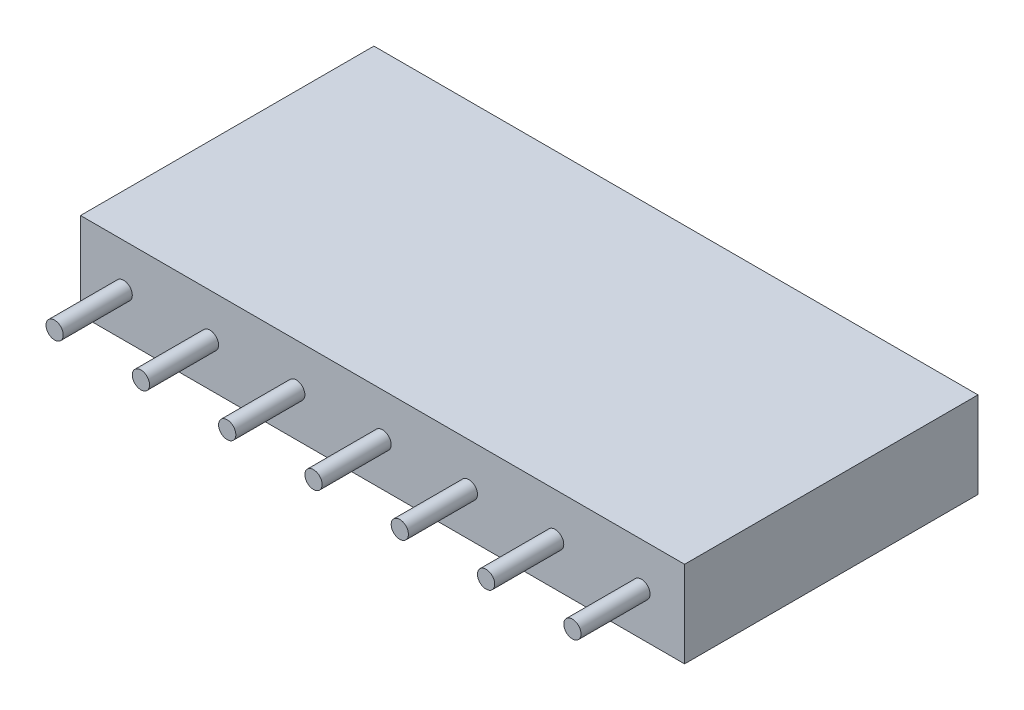
ISO-10303-21;
HEADER;
FILE_DESCRIPTION(('STEP AP214'),'2;1');
FILE_NAME('part.step','',(''),(''),'','','');
FILE_SCHEMA(('AUTOMOTIVE_DESIGN { 1 0 10303 214 1 1 1 1 }'));
ENDSEC;
DATA;
#1=APPLICATION_CONTEXT('core data for automotive mechanical design processes');
#2=APPLICATION_PROTOCOL_DEFINITION('international standard','automotive_design',2000,#1);
#3=PRODUCT_CONTEXT('',#1,'mechanical');
#4=PRODUCT('Part','Part','',(#3));
#5=PRODUCT_RELATED_PRODUCT_CATEGORY('part','',(#4));
#6=PRODUCT_DEFINITION_FORMATION('','',#4);
#7=PRODUCT_DEFINITION_CONTEXT('part definition',#1,'design');
#8=PRODUCT_DEFINITION('design','',#6,#7);
#9=PRODUCT_DEFINITION_SHAPE('','',#8);
#10=(LENGTH_UNIT() NAMED_UNIT(*) SI_UNIT(.MILLI.,.METRE.));
#11=(NAMED_UNIT(*) PLANE_ANGLE_UNIT() SI_UNIT($,.RADIAN.));
#12=(NAMED_UNIT(*) SI_UNIT($,.STERADIAN.) SOLID_ANGLE_UNIT());
#13=UNCERTAINTY_MEASURE_WITH_UNIT(LENGTH_MEASURE(1.E-05),#10,'distance_accuracy_value','');
#14=(GEOMETRIC_REPRESENTATION_CONTEXT(3) GLOBAL_UNCERTAINTY_ASSIGNED_CONTEXT((#13)) GLOBAL_UNIT_ASSIGNED_CONTEXT((#10,
#11,#12)) REPRESENTATION_CONTEXT('',''));
#15=CARTESIAN_POINT('',(0.,0.,0.));
#16=DIRECTION('',(0.,0.,1.));
#17=DIRECTION('',(1.,0.,0.));
#18=AXIS2_PLACEMENT_3D('',#15,#16,#17);
#19=CARTESIAN_POINT('',(-16.25,1.25,10.5));
#20=DIRECTION('',(0.,0.,1.));
#21=DIRECTION('',(1.,0.,0.));
#22=AXIS2_PLACEMENT_3D('',#19,#20,#21);
#23=PLANE('',#22);
#24=CARTESIAN_POINT('',(-16.25,1.25,10.5));
#25=DIRECTION('',(0.,0.,1.));
#26=DIRECTION('',(1.,0.,0.));
#27=AXIS2_PLACEMENT_3D('',#24,#25,#26);
#28=CIRCLE('',#27,0.25);
#29=CARTESIAN_POINT('',(-16.,1.25,10.5));
#30=VERTEX_POINT('',#29);
#31=EDGE_CURVE('E11',#30,#30,#28,.T.);
#32=ORIENTED_EDGE('',*,*,#31,.T.);
#33=EDGE_LOOP('',(#32));
#34=FACE_BOUND('',#33,.T.);
#35=ADVANCED_FACE('F33',(#34),#23,.T.);
#36=CARTESIAN_POINT('',(-16.25,1.25,10.5));
#37=DIRECTION('',(0.,0.,-1.));
#38=DIRECTION('',(-1.,0.,0.));
#39=AXIS2_PLACEMENT_3D('',#36,#37,#38);
#40=CYLINDRICAL_SURFACE('',#39,0.25);
#41=ORIENTED_EDGE('',*,*,#31,.F.);
#42=EDGE_LOOP('',(#41));
#43=FACE_BOUND('',#42,.T.);
#44=CARTESIAN_POINT('',(-16.25,1.25,8.5));
#45=DIRECTION('',(0.,0.,1.));
#46=DIRECTION('',(1.,0.,0.));
#47=AXIS2_PLACEMENT_3D('',#44,#45,#46);
#48=CIRCLE('',#47,0.25);
#49=CARTESIAN_POINT('',(-16.,1.25,8.5));
#50=VERTEX_POINT('',#49);
#51=EDGE_CURVE('E41',#50,#50,#48,.T.);
#52=ORIENTED_EDGE('',*,*,#51,.T.);
#53=EDGE_LOOP('',(#52));
#54=FACE_BOUND('',#53,.T.);
#55=ADVANCED_FACE('F147',(#43,#54),#40,.T.);
#56=CARTESIAN_POINT('',(-13.75,1.25,10.5));
#57=DIRECTION('',(0.,0.,1.));
#58=DIRECTION('',(1.,0.,0.));
#59=AXIS2_PLACEMENT_3D('',#56,#57,#58);
#60=PLANE('',#59);
#61=CARTESIAN_POINT('',(-13.75,1.25,10.5));
#62=DIRECTION('',(0.,0.,1.));
#63=DIRECTION('',(1.,0.,0.));
#64=AXIS2_PLACEMENT_3D('',#61,#62,#63);
#65=CIRCLE('',#64,0.25);
#66=CARTESIAN_POINT('',(-13.5,1.25,10.5));
#67=VERTEX_POINT('',#66);
#68=EDGE_CURVE('E142',#67,#67,#65,.T.);
#69=ORIENTED_EDGE('',*,*,#68,.T.);
#70=EDGE_LOOP('',(#69));
#71=FACE_BOUND('',#70,.T.);
#72=ADVANCED_FACE('F170',(#71),#60,.T.);
#73=CARTESIAN_POINT('',(-13.75,1.25,10.5));
#74=DIRECTION('',(0.,0.,-1.));
#75=DIRECTION('',(-1.,0.,0.));
#76=AXIS2_PLACEMENT_3D('',#73,#74,#75);
#77=CYLINDRICAL_SURFACE('',#76,0.25);
#78=ORIENTED_EDGE('',*,*,#68,.F.);
#79=EDGE_LOOP('',(#78));
#80=FACE_BOUND('',#79,.T.);
#81=CARTESIAN_POINT('',(-13.75,1.25,8.5));
#82=DIRECTION('',(0.,0.,1.));
#83=DIRECTION('',(1.,0.,0.));
#84=AXIS2_PLACEMENT_3D('',#81,#82,#83);
#85=CIRCLE('',#84,0.25);
#86=CARTESIAN_POINT('',(-13.5,1.25,8.5));
#87=VERTEX_POINT('',#86);
#88=EDGE_CURVE('E139',#87,#87,#85,.T.);
#89=ORIENTED_EDGE('',*,*,#88,.T.);
#90=EDGE_LOOP('',(#89));
#91=FACE_BOUND('',#90,.T.);
#92=ADVANCED_FACE('F176',(#80,#91),#77,.T.);
#93=CARTESIAN_POINT('',(-11.25,1.25,10.5));
#94=DIRECTION('',(0.,0.,1.));
#95=DIRECTION('',(1.,0.,0.));
#96=AXIS2_PLACEMENT_3D('',#93,#94,#95);
#97=PLANE('',#96);
#98=CARTESIAN_POINT('',(-11.25,1.25,10.5));
#99=DIRECTION('',(0.,0.,1.));
#100=DIRECTION('',(1.,0.,0.));
#101=AXIS2_PLACEMENT_3D('',#98,#99,#100);
#102=CIRCLE('',#101,0.25);
#103=CARTESIAN_POINT('',(-11.,1.25,10.5));
#104=VERTEX_POINT('',#103);
#105=EDGE_CURVE('E136',#104,#104,#102,.T.);
#106=ORIENTED_EDGE('',*,*,#105,.T.);
#107=EDGE_LOOP('',(#106));
#108=FACE_BOUND('',#107,.T.);
#109=ADVANCED_FACE('F182',(#108),#97,.T.);
#110=CARTESIAN_POINT('',(-11.25,1.25,10.5));
#111=DIRECTION('',(0.,0.,-1.));
#112=DIRECTION('',(-1.,0.,0.));
#113=AXIS2_PLACEMENT_3D('',#110,#111,#112);
#114=CYLINDRICAL_SURFACE('',#113,0.25);
#115=ORIENTED_EDGE('',*,*,#105,.F.);
#116=EDGE_LOOP('',(#115));
#117=FACE_BOUND('',#116,.T.);
#118=CARTESIAN_POINT('',(-11.25,1.25,8.5));
#119=DIRECTION('',(0.,0.,1.));
#120=DIRECTION('',(1.,0.,0.));
#121=AXIS2_PLACEMENT_3D('',#118,#119,#120);
#122=CIRCLE('',#121,0.25);
#123=CARTESIAN_POINT('',(-11.,1.25,8.5));
#124=VERTEX_POINT('',#123);
#125=EDGE_CURVE('E133',#124,#124,#122,.T.);
#126=ORIENTED_EDGE('',*,*,#125,.T.);
#127=EDGE_LOOP('',(#126));
#128=FACE_BOUND('',#127,.T.);
#129=ADVANCED_FACE('F186',(#117,#128),#114,.T.);
#130=CARTESIAN_POINT('',(-8.75,1.25,10.5));
#131=DIRECTION('',(0.,0.,1.));
#132=DIRECTION('',(1.,0.,0.));
#133=AXIS2_PLACEMENT_3D('',#130,#131,#132);
#134=PLANE('',#133);
#135=CARTESIAN_POINT('',(-8.75,1.25,10.5));
#136=DIRECTION('',(0.,0.,1.));
#137=DIRECTION('',(1.,0.,0.));
#138=AXIS2_PLACEMENT_3D('',#135,#136,#137);
#139=CIRCLE('',#138,0.25);
#140=CARTESIAN_POINT('',(-8.5,1.25,10.5));
#141=VERTEX_POINT('',#140);
#142=EDGE_CURVE('E130',#141,#141,#139,.T.);
#143=ORIENTED_EDGE('',*,*,#142,.T.);
#144=EDGE_LOOP('',(#143));
#145=FACE_BOUND('',#144,.T.);
#146=ADVANCED_FACE('F190',(#145),#134,.T.);
#147=CARTESIAN_POINT('',(-8.75,1.25,10.5));
#148=DIRECTION('',(0.,0.,-1.));
#149=DIRECTION('',(-1.,0.,0.));
#150=AXIS2_PLACEMENT_3D('',#147,#148,#149);
#151=CYLINDRICAL_SURFACE('',#150,0.25);
#152=ORIENTED_EDGE('',*,*,#142,.F.);
#153=EDGE_LOOP('',(#152));
#154=FACE_BOUND('',#153,.T.);
#155=CARTESIAN_POINT('',(-8.75,1.25,8.5));
#156=DIRECTION('',(0.,0.,1.));
#157=DIRECTION('',(1.,0.,0.));
#158=AXIS2_PLACEMENT_3D('',#155,#156,#157);
#159=CIRCLE('',#158,0.25);
#160=CARTESIAN_POINT('',(-8.5,1.25,8.5));
#161=VERTEX_POINT('',#160);
#162=EDGE_CURVE('E127',#161,#161,#159,.T.);
#163=ORIENTED_EDGE('',*,*,#162,.T.);
#164=EDGE_LOOP('',(#163));
#165=FACE_BOUND('',#164,.T.);
#166=ADVANCED_FACE('F194',(#154,#165),#151,.T.);
#167=CARTESIAN_POINT('',(-6.25,1.25,10.5));
#168=DIRECTION('',(0.,0.,1.));
#169=DIRECTION('',(1.,0.,0.));
#170=AXIS2_PLACEMENT_3D('',#167,#168,#169);
#171=PLANE('',#170);
#172=CARTESIAN_POINT('',(-6.25,1.25,10.5));
#173=DIRECTION('',(0.,0.,1.));
#174=DIRECTION('',(1.,0.,0.));
#175=AXIS2_PLACEMENT_3D('',#172,#173,#174);
#176=CIRCLE('',#175,0.25);
#177=CARTESIAN_POINT('',(-6.,1.25,10.5));
#178=VERTEX_POINT('',#177);
#179=EDGE_CURVE('E124',#178,#178,#176,.T.);
#180=ORIENTED_EDGE('',*,*,#179,.T.);
#181=EDGE_LOOP('',(#180));
#182=FACE_BOUND('',#181,.T.);
#183=ADVANCED_FACE('F198',(#182),#171,.T.);
#184=CARTESIAN_POINT('',(-6.25,1.25,10.5));
#185=DIRECTION('',(0.,0.,-1.));
#186=DIRECTION('',(-1.,0.,0.));
#187=AXIS2_PLACEMENT_3D('',#184,#185,#186);
#188=CYLINDRICAL_SURFACE('',#187,0.25);
#189=ORIENTED_EDGE('',*,*,#179,.F.);
#190=EDGE_LOOP('',(#189));
#191=FACE_BOUND('',#190,.T.);
#192=CARTESIAN_POINT('',(-6.25,1.25,8.5));
#193=DIRECTION('',(0.,0.,1.));
#194=DIRECTION('',(1.,0.,0.));
#195=AXIS2_PLACEMENT_3D('',#192,#193,#194);
#196=CIRCLE('',#195,0.25);
#197=CARTESIAN_POINT('',(-6.,1.25,8.5));
#198=VERTEX_POINT('',#197);
#199=EDGE_CURVE('E121',#198,#198,#196,.T.);
#200=ORIENTED_EDGE('',*,*,#199,.T.);
#201=EDGE_LOOP('',(#200));
#202=FACE_BOUND('',#201,.T.);
#203=ADVANCED_FACE('F202',(#191,#202),#188,.T.);
#204=CARTESIAN_POINT('',(0.,0.,8.5));
#205=DIRECTION('',(-1.,0.,0.));
#206=DIRECTION('',(0.,0.,1.));
#207=AXIS2_PLACEMENT_3D('',#204,#205,#206);
#208=PLANE('',#207);
#209=DIRECTION('',(0.,1.,0.));
#210=VECTOR('',#209,1.);
#211=CARTESIAN_POINT('',(0.,0.,0.));
#212=LINE('',#211,#210);
#213=CARTESIAN_POINT('',(0.,0.,0.));
#214=VERTEX_POINT('',#213);
#215=CARTESIAN_POINT('',(0.,2.5,0.));
#216=VERTEX_POINT('',#215);
#217=EDGE_CURVE('E79',#214,#216,#212,.T.);
#218=ORIENTED_EDGE('',*,*,#217,.T.);
#219=DIRECTION('',(0.,0.,-1.));
#220=VECTOR('',#219,1.);
#221=CARTESIAN_POINT('',(0.,2.5,8.5));
#222=LINE('',#221,#220);
#223=CARTESIAN_POINT('',(0.,2.5,8.5));
#224=VERTEX_POINT('',#223);
#225=EDGE_CURVE('E119',#224,#216,#222,.T.);
#226=ORIENTED_EDGE('',*,*,#225,.F.);
#227=DIRECTION('',(0.,1.,0.));
#228=VECTOR('',#227,1.);
#229=CARTESIAN_POINT('',(0.,0.,8.5));
#230=LINE('',#229,#228);
#231=CARTESIAN_POINT('',(0.,0.,8.5));
#232=VERTEX_POINT('',#231);
#233=EDGE_CURVE('E81',#232,#224,#230,.T.);
#234=ORIENTED_EDGE('',*,*,#233,.F.);
#235=DIRECTION('',(0.,0.,-1.));
#236=VECTOR('',#235,1.);
#237=CARTESIAN_POINT('',(0.,0.,8.5));
#238=LINE('',#237,#236);
#239=EDGE_CURVE('E115',#232,#214,#238,.T.);
#240=ORIENTED_EDGE('',*,*,#239,.T.);
#241=EDGE_LOOP('',(#218,#226,#234,#240));
#242=FACE_BOUND('',#241,.T.);
#243=ADVANCED_FACE('F206',(#242),#208,.F.);
#244=CARTESIAN_POINT('',(0.,2.5,8.5));
#245=DIRECTION('',(0.,-1.,0.));
#246=DIRECTION('',(1.,0.,0.));
#247=AXIS2_PLACEMENT_3D('',#244,#245,#246);
#248=PLANE('',#247);
#249=DIRECTION('',(-1.,0.,0.));
#250=VECTOR('',#249,1.);
#251=CARTESIAN_POINT('',(0.,2.5,0.));
#252=LINE('',#251,#250);
#253=CARTESIAN_POINT('',(-17.5,2.5,0.));
#254=VERTEX_POINT('',#253);
#255=EDGE_CURVE('E61',#216,#254,#252,.T.);
#256=ORIENTED_EDGE('',*,*,#255,.T.);
#257=DIRECTION('',(0.,0.,-1.));
#258=VECTOR('',#257,1.);
#259=CARTESIAN_POINT('',(-17.5,2.5,8.5));
#260=LINE('',#259,#258);
#261=CARTESIAN_POINT('',(-17.5,2.5,8.5));
#262=VERTEX_POINT('',#261);
#263=EDGE_CURVE('E90',#262,#254,#260,.T.);
#264=ORIENTED_EDGE('',*,*,#263,.F.);
#265=DIRECTION('',(-1.,0.,0.));
#266=VECTOR('',#265,1.);
#267=CARTESIAN_POINT('',(0.,2.5,8.5));
#268=LINE('',#267,#266);
#269=EDGE_CURVE('E112',#224,#262,#268,.T.);
#270=ORIENTED_EDGE('',*,*,#269,.F.);
#271=ORIENTED_EDGE('',*,*,#225,.T.);
#272=EDGE_LOOP('',(#256,#264,#270,#271));
#273=FACE_BOUND('',#272,.T.);
#274=ADVANCED_FACE('F160',(#273),#248,.F.);
#275=CARTESIAN_POINT('',(0.,0.,8.5));
#276=DIRECTION('',(0.,1.,0.));
#277=DIRECTION('',(0.,0.,1.));
#278=AXIS2_PLACEMENT_3D('',#275,#276,#277);
#279=PLANE('',#278);
#280=DIRECTION('',(1.,0.,0.));
#281=VECTOR('',#280,1.);
#282=CARTESIAN_POINT('',(0.,0.,0.));
#283=LINE('',#282,#281);
#284=CARTESIAN_POINT('',(-17.5,0.,0.));
#285=VERTEX_POINT('',#284);
#286=EDGE_CURVE('E74',#285,#214,#283,.T.);
#287=ORIENTED_EDGE('',*,*,#286,.T.);
#288=ORIENTED_EDGE('',*,*,#239,.F.);
#289=DIRECTION('',(1.,0.,0.));
#290=VECTOR('',#289,1.);
#291=CARTESIAN_POINT('',(0.,0.,8.5));
#292=LINE('',#291,#290);
#293=CARTESIAN_POINT('',(-17.5,0.,8.5));
#294=VERTEX_POINT('',#293);
#295=EDGE_CURVE('E49',#294,#232,#292,.T.);
#296=ORIENTED_EDGE('',*,*,#295,.F.);
#297=DIRECTION('',(0.,0.,-1.));
#298=VECTOR('',#297,1.);
#299=CARTESIAN_POINT('',(-17.5,0.,8.5));
#300=LINE('',#299,#298);
#301=EDGE_CURVE('E88',#294,#285,#300,.T.);
#302=ORIENTED_EDGE('',*,*,#301,.T.);
#303=EDGE_LOOP('',(#287,#288,#296,#302));
#304=FACE_BOUND('',#303,.T.);
#305=ADVANCED_FACE('F94',(#304),#279,.F.);
#306=CARTESIAN_POINT('',(0.,0.,8.5));
#307=DIRECTION('',(0.,0.,1.));
#308=DIRECTION('',(1.,0.,0.));
#309=AXIS2_PLACEMENT_3D('',#306,#307,#308);
#310=PLANE('',#309);
#311=CARTESIAN_POINT('',(-3.75,1.25,8.5));
#312=DIRECTION('',(0.,0.,1.));
#313=DIRECTION('',(1.,0.,0.));
#314=AXIS2_PLACEMENT_3D('',#311,#312,#313);
#315=CIRCLE('',#314,0.25);
#316=CARTESIAN_POINT('',(-3.5,1.25,8.5));
#317=VERTEX_POINT('',#316);
#318=EDGE_CURVE('E519',#317,#317,#315,.T.);
#319=ORIENTED_EDGE('',*,*,#318,.F.);
#320=EDGE_LOOP('',(#319));
#321=FACE_BOUND('',#320,.T.);
#322=CARTESIAN_POINT('',(-1.25,1.25,8.5));
#323=DIRECTION('',(0.,0.,1.));
#324=DIRECTION('',(1.,0.,0.));
#325=AXIS2_PLACEMENT_3D('',#322,#323,#324);
#326=CIRCLE('',#325,0.25);
#327=CARTESIAN_POINT('',(-1.,1.25,8.5));
#328=VERTEX_POINT('',#327);
#329=EDGE_CURVE('E103',#328,#328,#326,.T.);
#330=ORIENTED_EDGE('',*,*,#329,.F.);
#331=EDGE_LOOP('',(#330));
#332=FACE_BOUND('',#331,.T.);
#333=ORIENTED_EDGE('',*,*,#233,.T.);
#334=ORIENTED_EDGE('',*,*,#269,.T.);
#335=DIRECTION('',(0.,-1.,0.));
#336=VECTOR('',#335,1.);
#337=CARTESIAN_POINT('',(-17.5,0.,8.5));
#338=LINE('',#337,#336);
#339=EDGE_CURVE('E91',#262,#294,#338,.T.);
#340=ORIENTED_EDGE('',*,*,#339,.T.);
#341=ORIENTED_EDGE('',*,*,#295,.T.);
#342=EDGE_LOOP('',(#333,#334,#340,#341));
#343=FACE_BOUND('',#342,.T.);
#344=ORIENTED_EDGE('',*,*,#199,.F.);
#345=EDGE_LOOP('',(#344));
#346=FACE_BOUND('',#345,.T.);
#347=ORIENTED_EDGE('',*,*,#162,.F.);
#348=EDGE_LOOP('',(#347));
#349=FACE_BOUND('',#348,.T.);
#350=ORIENTED_EDGE('',*,*,#125,.F.);
#351=EDGE_LOOP('',(#350));
#352=FACE_BOUND('',#351,.T.);
#353=ORIENTED_EDGE('',*,*,#88,.F.);
#354=EDGE_LOOP('',(#353));
#355=FACE_BOUND('',#354,.T.);
#356=ORIENTED_EDGE('',*,*,#51,.F.);
#357=EDGE_LOOP('',(#356));
#358=FACE_BOUND('',#357,.T.);
#359=ADVANCED_FACE('F149',(#321,#332,#343,#346,#349,#352,#355,#358),#310,.T.);
#360=CARTESIAN_POINT('',(0.,0.,0.));
#361=DIRECTION('',(0.,0.,1.));
#362=DIRECTION('',(1.,0.,0.));
#363=AXIS2_PLACEMENT_3D('',#360,#361,#362);
#364=PLANE('',#363);
#365=CARTESIAN_POINT('',(-3.75,1.25,0.));
#366=DIRECTION('',(0.,0.,-1.));
#367=DIRECTION('',(-1.,0.,0.));
#368=AXIS2_PLACEMENT_3D('',#365,#366,#367);
#369=CIRCLE('',#368,0.25);
#370=CARTESIAN_POINT('',(-4.,1.25,0.));
#371=VERTEX_POINT('',#370);
#372=EDGE_CURVE('E520',#371,#371,#369,.T.);
#373=ORIENTED_EDGE('',*,*,#372,.F.);
#374=EDGE_LOOP('',(#373));
#375=FACE_BOUND('',#374,.T.);
#376=CARTESIAN_POINT('',(-6.25,1.25,0.));
#377=DIRECTION('',(0.,0.,-1.));
#378=DIRECTION('',(-1.,0.,0.));
#379=AXIS2_PLACEMENT_3D('',#376,#377,#378);
#380=CIRCLE('',#379,0.25);
#381=CARTESIAN_POINT('',(-6.5,1.25,0.));
#382=VERTEX_POINT('',#381);
#383=EDGE_CURVE('E530',#382,#382,#380,.T.);
#384=ORIENTED_EDGE('',*,*,#383,.F.);
#385=EDGE_LOOP('',(#384));
#386=FACE_BOUND('',#385,.T.);
#387=CARTESIAN_POINT('',(-8.75,1.25,0.));
#388=DIRECTION('',(0.,0.,-1.));
#389=DIRECTION('',(-1.,0.,0.));
#390=AXIS2_PLACEMENT_3D('',#387,#388,#389);
#391=CIRCLE('',#390,0.25);
#392=CARTESIAN_POINT('',(-9.,1.25,0.));
#393=VERTEX_POINT('',#392);
#394=EDGE_CURVE('E536',#393,#393,#391,.T.);
#395=ORIENTED_EDGE('',*,*,#394,.F.);
#396=EDGE_LOOP('',(#395));
#397=FACE_BOUND('',#396,.T.);
#398=CARTESIAN_POINT('',(-11.25,1.25,0.));
#399=DIRECTION('',(0.,0.,-1.));
#400=DIRECTION('',(-1.,0.,0.));
#401=AXIS2_PLACEMENT_3D('',#398,#399,#400);
#402=CIRCLE('',#401,0.25);
#403=CARTESIAN_POINT('',(-11.5,1.25,0.));
#404=VERTEX_POINT('',#403);
#405=EDGE_CURVE('E542',#404,#404,#402,.T.);
#406=ORIENTED_EDGE('',*,*,#405,.F.);
#407=EDGE_LOOP('',(#406));
#408=FACE_BOUND('',#407,.T.);
#409=CARTESIAN_POINT('',(-13.75,1.25,0.));
#410=DIRECTION('',(0.,0.,-1.));
#411=DIRECTION('',(-1.,0.,0.));
#412=AXIS2_PLACEMENT_3D('',#409,#410,#411);
#413=CIRCLE('',#412,0.25);
#414=CARTESIAN_POINT('',(-14.,1.25,0.));
#415=VERTEX_POINT('',#414);
#416=EDGE_CURVE('E548',#415,#415,#413,.T.);
#417=ORIENTED_EDGE('',*,*,#416,.F.);
#418=EDGE_LOOP('',(#417));
#419=FACE_BOUND('',#418,.T.);
#420=CARTESIAN_POINT('',(-16.25,1.25,0.));
#421=DIRECTION('',(0.,0.,-1.));
#422=DIRECTION('',(-1.,0.,0.));
#423=AXIS2_PLACEMENT_3D('',#420,#421,#422);
#424=CIRCLE('',#423,0.25);
#425=CARTESIAN_POINT('',(-16.5,1.25,0.));
#426=VERTEX_POINT('',#425);
#427=EDGE_CURVE('E554',#426,#426,#424,.T.);
#428=ORIENTED_EDGE('',*,*,#427,.F.);
#429=EDGE_LOOP('',(#428));
#430=FACE_BOUND('',#429,.T.);
#431=CARTESIAN_POINT('',(-1.25,1.25,0.));
#432=DIRECTION('',(0.,0.,-1.));
#433=DIRECTION('',(-1.,0.,0.));
#434=AXIS2_PLACEMENT_3D('',#431,#432,#433);
#435=CIRCLE('',#434,0.25);
#436=CARTESIAN_POINT('',(-1.5,1.25,0.));
#437=VERTEX_POINT('',#436);
#438=EDGE_CURVE('E96',#437,#437,#435,.T.);
#439=ORIENTED_EDGE('',*,*,#438,.F.);
#440=EDGE_LOOP('',(#439));
#441=FACE_BOUND('',#440,.T.);
#442=ORIENTED_EDGE('',*,*,#217,.F.);
#443=ORIENTED_EDGE('',*,*,#286,.F.);
#444=DIRECTION('',(0.,-1.,0.));
#445=VECTOR('',#444,1.);
#446=CARTESIAN_POINT('',(-17.5,0.,0.));
#447=LINE('',#446,#445);
#448=EDGE_CURVE('E77',#254,#285,#447,.T.);
#449=ORIENTED_EDGE('',*,*,#448,.F.);
#450=ORIENTED_EDGE('',*,*,#255,.F.);
#451=EDGE_LOOP('',(#442,#443,#449,#450));
#452=FACE_BOUND('',#451,.T.);
#453=ADVANCED_FACE('F76',(#375,#386,#397,#408,#419,#430,#441,#452),#364,.F.);
#454=CARTESIAN_POINT('',(-1.25,1.25,10.5));
#455=DIRECTION('',(0.,0.,-1.));
#456=DIRECTION('',(-1.,0.,0.));
#457=AXIS2_PLACEMENT_3D('',#454,#455,#456);
#458=CYLINDRICAL_SURFACE('',#457,0.25);
#459=CARTESIAN_POINT('',(-1.25,1.25,10.5));
#460=DIRECTION('',(0.,0.,1.));
#461=DIRECTION('',(1.,0.,0.));
#462=AXIS2_PLACEMENT_3D('',#459,#460,#461);
#463=CIRCLE('',#462,0.25);
#464=CARTESIAN_POINT('',(-1.,1.25,10.5));
#465=VERTEX_POINT('',#464);
#466=EDGE_CURVE('E106',#465,#465,#463,.T.);
#467=ORIENTED_EDGE('',*,*,#466,.F.);
#468=EDGE_LOOP('',(#467));
#469=FACE_BOUND('',#468,.T.);
#470=ORIENTED_EDGE('',*,*,#329,.T.);
#471=EDGE_LOOP('',(#470));
#472=FACE_BOUND('',#471,.T.);
#473=ADVANCED_FACE('F157',(#469,#472),#458,.T.);
#474=CARTESIAN_POINT('',(-1.25,1.25,10.5));
#475=DIRECTION('',(0.,0.,1.));
#476=DIRECTION('',(1.,0.,0.));
#477=AXIS2_PLACEMENT_3D('',#474,#475,#476);
#478=PLANE('',#477);
#479=ORIENTED_EDGE('',*,*,#466,.T.);
#480=EDGE_LOOP('',(#479));
#481=FACE_BOUND('',#480,.T.);
#482=ADVANCED_FACE('F413',(#481),#478,.T.);
#483=CARTESIAN_POINT('',(-1.25,1.25,4.));
#484=DIRECTION('',(0.,0.,-1.));
#485=DIRECTION('',(-1.,0.,0.));
#486=AXIS2_PLACEMENT_3D('',#483,#484,#485);
#487=CYLINDRICAL_SURFACE('',#486,0.25);
#488=CARTESIAN_POINT('',(-1.25,1.25,4.));
#489=DIRECTION('',(0.,0.,-1.));
#490=DIRECTION('',(-1.,0.,0.));
#491=AXIS2_PLACEMENT_3D('',#488,#489,#490);
#492=CIRCLE('',#491,0.25);
#493=CARTESIAN_POINT('',(-1.5,1.25,4.));
#494=VERTEX_POINT('',#493);
#495=EDGE_CURVE('E100',#494,#494,#492,.T.);
#496=ORIENTED_EDGE('',*,*,#495,.F.);
#497=EDGE_LOOP('',(#496));
#498=FACE_BOUND('',#497,.T.);
#499=ORIENTED_EDGE('',*,*,#438,.T.);
#500=EDGE_LOOP('',(#499));
#501=FACE_BOUND('',#500,.T.);
#502=ADVANCED_FACE('F409',(#498,#501),#487,.F.);
#503=CARTESIAN_POINT('',(-1.25,1.25,4.));
#504=DIRECTION('',(0.,0.,-1.));
#505=DIRECTION('',(-1.,0.,0.));
#506=AXIS2_PLACEMENT_3D('',#503,#504,#505);
#507=PLANE('',#506);
#508=ORIENTED_EDGE('',*,*,#495,.T.);
#509=EDGE_LOOP('',(#508));
#510=FACE_BOUND('',#509,.T.);
#511=ADVANCED_FACE('F260',(#510),#507,.T.);
#512=CARTESIAN_POINT('',(-17.5,0.,8.5));
#513=DIRECTION('',(1.,0.,0.));
#514=DIRECTION('',(0.,0.,-1.));
#515=AXIS2_PLACEMENT_3D('',#512,#513,#514);
#516=PLANE('',#515);
#517=ORIENTED_EDGE('',*,*,#448,.T.);
#518=ORIENTED_EDGE('',*,*,#301,.F.);
#519=ORIENTED_EDGE('',*,*,#339,.F.);
#520=ORIENTED_EDGE('',*,*,#263,.T.);
#521=EDGE_LOOP('',(#517,#518,#519,#520));
#522=FACE_BOUND('',#521,.T.);
#523=ADVANCED_FACE('F86',(#522),#516,.F.);
#524=CARTESIAN_POINT('',(-3.75,1.25,10.5));
#525=DIRECTION('',(0.,0.,-1.));
#526=DIRECTION('',(-1.,0.,0.));
#527=AXIS2_PLACEMENT_3D('',#524,#525,#526);
#528=CYLINDRICAL_SURFACE('',#527,0.25);
#529=CARTESIAN_POINT('',(-3.75,1.25,10.5));
#530=DIRECTION('',(0.,0.,1.));
#531=DIRECTION('',(1.,0.,0.));
#532=AXIS2_PLACEMENT_3D('',#529,#530,#531);
#533=CIRCLE('',#532,0.25);
#534=CARTESIAN_POINT('',(-3.5,1.25,10.5));
#535=VERTEX_POINT('',#534);
#536=EDGE_CURVE('E92',#535,#535,#533,.T.);
#537=ORIENTED_EDGE('',*,*,#536,.F.);
#538=EDGE_LOOP('',(#537));
#539=FACE_BOUND('',#538,.T.);
#540=ORIENTED_EDGE('',*,*,#318,.T.);
#541=EDGE_LOOP('',(#540));
#542=FACE_BOUND('',#541,.T.);
#543=ADVANCED_FACE('F259',(#539,#542),#528,.T.);
#544=CARTESIAN_POINT('',(-3.75,1.25,10.5));
#545=DIRECTION('',(0.,0.,1.));
#546=DIRECTION('',(1.,0.,0.));
#547=AXIS2_PLACEMENT_3D('',#544,#545,#546);
#548=PLANE('',#547);
#549=ORIENTED_EDGE('',*,*,#536,.T.);
#550=EDGE_LOOP('',(#549));
#551=FACE_BOUND('',#550,.T.);
#552=ADVANCED_FACE('F271',(#551),#548,.T.);
#553=CARTESIAN_POINT('',(-16.25,1.25,4.));
#554=DIRECTION('',(0.,0.,-1.));
#555=DIRECTION('',(-1.,0.,0.));
#556=AXIS2_PLACEMENT_3D('',#553,#554,#555);
#557=CYLINDRICAL_SURFACE('',#556,0.25);
#558=CARTESIAN_POINT('',(-16.25,1.25,4.));
#559=DIRECTION('',(0.,0.,-1.));
#560=DIRECTION('',(-1.,0.,0.));
#561=AXIS2_PLACEMENT_3D('',#558,#559,#560);
#562=CIRCLE('',#561,0.25);
#563=CARTESIAN_POINT('',(-16.5,1.25,4.));
#564=VERTEX_POINT('',#563);
#565=EDGE_CURVE('E551',#564,#564,#562,.T.);
#566=ORIENTED_EDGE('',*,*,#565,.F.);
#567=EDGE_LOOP('',(#566));
#568=FACE_BOUND('',#567,.T.);
#569=ORIENTED_EDGE('',*,*,#427,.T.);
#570=EDGE_LOOP('',(#569));
#571=FACE_BOUND('',#570,.T.);
#572=ADVANCED_FACE('F282',(#568,#571),#557,.F.);
#573=CARTESIAN_POINT('',(-16.25,1.25,4.));
#574=DIRECTION('',(0.,0.,-1.));
#575=DIRECTION('',(-1.,0.,0.));
#576=AXIS2_PLACEMENT_3D('',#573,#574,#575);
#577=PLANE('',#576);
#578=ORIENTED_EDGE('',*,*,#565,.T.);
#579=EDGE_LOOP('',(#578));
#580=FACE_BOUND('',#579,.T.);
#581=ADVANCED_FACE('F292',(#580),#577,.T.);
#582=CARTESIAN_POINT('',(-13.75,1.25,4.));
#583=DIRECTION('',(0.,0.,-1.));
#584=DIRECTION('',(-1.,0.,0.));
#585=AXIS2_PLACEMENT_3D('',#582,#583,#584);
#586=CYLINDRICAL_SURFACE('',#585,0.25);
#587=CARTESIAN_POINT('',(-13.75,1.25,4.));
#588=DIRECTION('',(0.,0.,-1.));
#589=DIRECTION('',(-1.,0.,0.));
#590=AXIS2_PLACEMENT_3D('',#587,#588,#589);
#591=CIRCLE('',#590,0.25);
#592=CARTESIAN_POINT('',(-14.,1.25,4.));
#593=VERTEX_POINT('',#592);
#594=EDGE_CURVE('E545',#593,#593,#591,.T.);
#595=ORIENTED_EDGE('',*,*,#594,.F.);
#596=EDGE_LOOP('',(#595));
#597=FACE_BOUND('',#596,.T.);
#598=ORIENTED_EDGE('',*,*,#416,.T.);
#599=EDGE_LOOP('',(#598));
#600=FACE_BOUND('',#599,.T.);
#601=ADVANCED_FACE('F302',(#597,#600),#586,.F.);
#602=CARTESIAN_POINT('',(-13.75,1.25,4.));
#603=DIRECTION('',(0.,0.,-1.));
#604=DIRECTION('',(-1.,0.,0.));
#605=AXIS2_PLACEMENT_3D('',#602,#603,#604);
#606=PLANE('',#605);
#607=ORIENTED_EDGE('',*,*,#594,.T.);
#608=EDGE_LOOP('',(#607));
#609=FACE_BOUND('',#608,.T.);
#610=ADVANCED_FACE('F312',(#609),#606,.T.);
#611=CARTESIAN_POINT('',(-11.25,1.25,4.));
#612=DIRECTION('',(0.,0.,-1.));
#613=DIRECTION('',(-1.,0.,0.));
#614=AXIS2_PLACEMENT_3D('',#611,#612,#613);
#615=CYLINDRICAL_SURFACE('',#614,0.25);
#616=CARTESIAN_POINT('',(-11.25,1.25,4.));
#617=DIRECTION('',(0.,0.,-1.));
#618=DIRECTION('',(-1.,0.,0.));
#619=AXIS2_PLACEMENT_3D('',#616,#617,#618);
#620=CIRCLE('',#619,0.25);
#621=CARTESIAN_POINT('',(-11.5,1.25,4.));
#622=VERTEX_POINT('',#621);
#623=EDGE_CURVE('E539',#622,#622,#620,.T.);
#624=ORIENTED_EDGE('',*,*,#623,.F.);
#625=EDGE_LOOP('',(#624));
#626=FACE_BOUND('',#625,.T.);
#627=ORIENTED_EDGE('',*,*,#405,.T.);
#628=EDGE_LOOP('',(#627));
#629=FACE_BOUND('',#628,.T.);
#630=ADVANCED_FACE('F322',(#626,#629),#615,.F.);
#631=CARTESIAN_POINT('',(-11.25,1.25,4.));
#632=DIRECTION('',(0.,0.,-1.));
#633=DIRECTION('',(-1.,0.,0.));
#634=AXIS2_PLACEMENT_3D('',#631,#632,#633);
#635=PLANE('',#634);
#636=ORIENTED_EDGE('',*,*,#623,.T.);
#637=EDGE_LOOP('',(#636));
#638=FACE_BOUND('',#637,.T.);
#639=ADVANCED_FACE('F332',(#638),#635,.T.);
#640=CARTESIAN_POINT('',(-8.75,1.25,4.));
#641=DIRECTION('',(0.,0.,-1.));
#642=DIRECTION('',(-1.,0.,0.));
#643=AXIS2_PLACEMENT_3D('',#640,#641,#642);
#644=CYLINDRICAL_SURFACE('',#643,0.25);
#645=CARTESIAN_POINT('',(-8.75,1.25,4.));
#646=DIRECTION('',(0.,0.,-1.));
#647=DIRECTION('',(-1.,0.,0.));
#648=AXIS2_PLACEMENT_3D('',#645,#646,#647);
#649=CIRCLE('',#648,0.25);
#650=CARTESIAN_POINT('',(-9.,1.25,4.));
#651=VERTEX_POINT('',#650);
#652=EDGE_CURVE('E533',#651,#651,#649,.T.);
#653=ORIENTED_EDGE('',*,*,#652,.F.);
#654=EDGE_LOOP('',(#653));
#655=FACE_BOUND('',#654,.T.);
#656=ORIENTED_EDGE('',*,*,#394,.T.);
#657=EDGE_LOOP('',(#656));
#658=FACE_BOUND('',#657,.T.);
#659=ADVANCED_FACE('F342',(#655,#658),#644,.F.);
#660=CARTESIAN_POINT('',(-8.75,1.25,4.));
#661=DIRECTION('',(0.,0.,-1.));
#662=DIRECTION('',(-1.,0.,0.));
#663=AXIS2_PLACEMENT_3D('',#660,#661,#662);
#664=PLANE('',#663);
#665=ORIENTED_EDGE('',*,*,#652,.T.);
#666=EDGE_LOOP('',(#665));
#667=FACE_BOUND('',#666,.T.);
#668=ADVANCED_FACE('F352',(#667),#664,.T.);
#669=CARTESIAN_POINT('',(-6.25,1.25,4.));
#670=DIRECTION('',(0.,0.,-1.));
#671=DIRECTION('',(-1.,0.,0.));
#672=AXIS2_PLACEMENT_3D('',#669,#670,#671);
#673=CYLINDRICAL_SURFACE('',#672,0.25);
#674=CARTESIAN_POINT('',(-6.25,1.25,4.));
#675=DIRECTION('',(0.,0.,-1.));
#676=DIRECTION('',(-1.,0.,0.));
#677=AXIS2_PLACEMENT_3D('',#674,#675,#676);
#678=CIRCLE('',#677,0.25);
#679=CARTESIAN_POINT('',(-6.5,1.25,4.));
#680=VERTEX_POINT('',#679);
#681=EDGE_CURVE('E525',#680,#680,#678,.T.);
#682=ORIENTED_EDGE('',*,*,#681,.F.);
#683=EDGE_LOOP('',(#682));
#684=FACE_BOUND('',#683,.T.);
#685=ORIENTED_EDGE('',*,*,#383,.T.);
#686=EDGE_LOOP('',(#685));
#687=FACE_BOUND('',#686,.T.);
#688=ADVANCED_FACE('F362',(#684,#687),#673,.F.);
#689=CARTESIAN_POINT('',(-6.25,1.25,4.));
#690=DIRECTION('',(0.,0.,-1.));
#691=DIRECTION('',(-1.,0.,0.));
#692=AXIS2_PLACEMENT_3D('',#689,#690,#691);
#693=PLANE('',#692);
#694=ORIENTED_EDGE('',*,*,#681,.T.);
#695=EDGE_LOOP('',(#694));
#696=FACE_BOUND('',#695,.T.);
#697=ADVANCED_FACE('F372',(#696),#693,.T.);
#698=CARTESIAN_POINT('',(-3.75,1.25,4.));
#699=DIRECTION('',(0.,0.,-1.));
#700=DIRECTION('',(-1.,0.,0.));
#701=AXIS2_PLACEMENT_3D('',#698,#699,#700);
#702=CYLINDRICAL_SURFACE('',#701,0.25);
#703=CARTESIAN_POINT('',(-3.75,1.25,4.));
#704=DIRECTION('',(0.,0.,-1.));
#705=DIRECTION('',(-1.,0.,0.));
#706=AXIS2_PLACEMENT_3D('',#703,#704,#705);
#707=CIRCLE('',#706,0.25);
#708=CARTESIAN_POINT('',(-4.,1.25,4.));
#709=VERTEX_POINT('',#708);
#710=EDGE_CURVE('E518',#709,#709,#707,.T.);
#711=ORIENTED_EDGE('',*,*,#710,.F.);
#712=EDGE_LOOP('',(#711));
#713=FACE_BOUND('',#712,.T.);
#714=ORIENTED_EDGE('',*,*,#372,.T.);
#715=EDGE_LOOP('',(#714));
#716=FACE_BOUND('',#715,.T.);
#717=ADVANCED_FACE('F382',(#713,#716),#702,.F.);
#718=CARTESIAN_POINT('',(-3.75,1.25,4.));
#719=DIRECTION('',(0.,0.,-1.));
#720=DIRECTION('',(-1.,0.,0.));
#721=AXIS2_PLACEMENT_3D('',#718,#719,#720);
#722=PLANE('',#721);
#723=ORIENTED_EDGE('',*,*,#710,.T.);
#724=EDGE_LOOP('',(#723));
#725=FACE_BOUND('',#724,.T.);
#726=ADVANCED_FACE('F392',(#725),#722,.T.);
#727=CLOSED_SHELL('',(#35,#55,#72,#92,#109,#129,#146,#166,#183,#203,#243,#274,#305,#359,#453,
#473,#482,#502,#511,#523,#543,#552,#572,#581,#601,#610,#630,#639,#659,#668,#688,#697,#717,#726));
#728=MANIFOLD_SOLID_BREP('B2',#727);
#729=ADVANCED_BREP_SHAPE_REPRESENTATION('',(#18,#728),#14);
#730=SHAPE_DEFINITION_REPRESENTATION(#9,#729);
ENDSEC;
END-ISO-10303-21;
